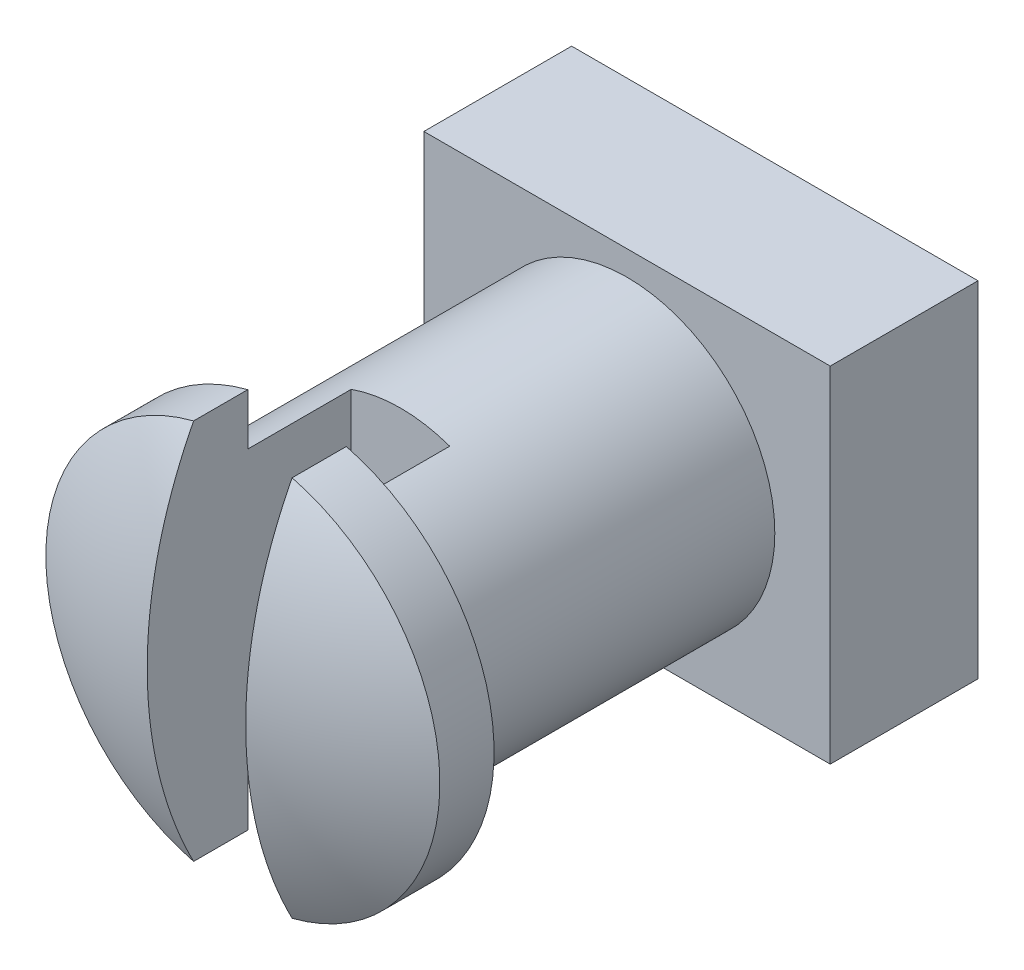
ISO-10303-21;
HEADER;
FILE_DESCRIPTION(('STEP AP214'),'2;1');
FILE_NAME('part.step','',(''),(''),'','','');
FILE_SCHEMA(('AUTOMOTIVE_DESIGN { 1 0 10303 214 1 1 1 1 }'));
ENDSEC;
DATA;
#1=APPLICATION_CONTEXT('core data for automotive mechanical design processes');
#2=APPLICATION_PROTOCOL_DEFINITION('international standard','automotive_design',2000,#1);
#3=PRODUCT_CONTEXT('',#1,'mechanical');
#4=PRODUCT('Part','Part','',(#3));
#5=PRODUCT_RELATED_PRODUCT_CATEGORY('part','',(#4));
#6=PRODUCT_DEFINITION_FORMATION('','',#4);
#7=PRODUCT_DEFINITION_CONTEXT('part definition',#1,'design');
#8=PRODUCT_DEFINITION('design','',#6,#7);
#9=PRODUCT_DEFINITION_SHAPE('','',#8);
#10=(LENGTH_UNIT() NAMED_UNIT(*) SI_UNIT(.MILLI.,.METRE.));
#11=(NAMED_UNIT(*) PLANE_ANGLE_UNIT() SI_UNIT($,.RADIAN.));
#12=(NAMED_UNIT(*) SI_UNIT($,.STERADIAN.) SOLID_ANGLE_UNIT());
#13=UNCERTAINTY_MEASURE_WITH_UNIT(LENGTH_MEASURE(1.E-05),#10,'distance_accuracy_value','');
#14=(GEOMETRIC_REPRESENTATION_CONTEXT(3) GLOBAL_UNCERTAINTY_ASSIGNED_CONTEXT((#13)) GLOBAL_UNIT_ASSIGNED_CONTEXT((#10,
#11,#12)) REPRESENTATION_CONTEXT('',''));
#15=CARTESIAN_POINT('',(0.,0.,0.));
#16=DIRECTION('',(0.,0.,1.));
#17=DIRECTION('',(1.,0.,0.));
#18=AXIS2_PLACEMENT_3D('',#15,#16,#17);
#19=CARTESIAN_POINT('',(0.,0.,12.319));
#20=DIRECTION('',(0.,0.,1.));
#21=DIRECTION('',(1.,0.,0.));
#22=AXIS2_PLACEMENT_3D('',#19,#20,#21);
#23=CYLINDRICAL_SURFACE('',#22,5.08);
#24=DIRECTION('',(0.,0.,1.));
#25=VECTOR('',#24,1.);
#26=CARTESIAN_POINT('',(1.27,4.91868884968342,12.319));
#27=LINE('',#26,#25);
#28=CARTESIAN_POINT('',(1.27,4.91868884968342,13.716));
#29=VERTEX_POINT('',#28);
#30=CARTESIAN_POINT('',(1.27,4.91868884968342,12.319));
#31=VERTEX_POINT('',#30);
#32=EDGE_CURVE('E165',#29,#31,#27,.F.);
#33=ORIENTED_EDGE('',*,*,#32,.F.);
#34=CARTESIAN_POINT('',(0.,0.,13.716));
#35=DIRECTION('',(0.,0.,1.));
#36=DIRECTION('',(1.,0.,0.));
#37=AXIS2_PLACEMENT_3D('',#34,#35,#36);
#38=CIRCLE('',#37,5.08);
#39=CARTESIAN_POINT('',(1.27,-4.91868884968342,13.716));
#40=VERTEX_POINT('',#39);
#41=EDGE_CURVE('E143',#40,#29,#38,.T.);
#42=ORIENTED_EDGE('',*,*,#41,.F.);
#43=DIRECTION('',(0.,0.,1.));
#44=VECTOR('',#43,1.);
#45=CARTESIAN_POINT('',(1.27,-4.91868884968342,12.319));
#46=LINE('',#45,#44);
#47=CARTESIAN_POINT('',(1.27,-4.91868884968342,12.319));
#48=VERTEX_POINT('',#47);
#49=EDGE_CURVE('E167',#48,#40,#46,.T.);
#50=ORIENTED_EDGE('',*,*,#49,.F.);
#51=CARTESIAN_POINT('',(0.,0.,12.319));
#52=DIRECTION('',(0.,0.,1.));
#53=DIRECTION('',(1.,0.,0.));
#54=AXIS2_PLACEMENT_3D('',#51,#52,#53);
#55=CIRCLE('',#54,5.08);
#56=EDGE_CURVE('E154',#48,#31,#55,.T.);
#57=ORIENTED_EDGE('',*,*,#56,.T.);
#58=EDGE_LOOP('',(#33,#42,#50,#57));
#59=FACE_BOUND('',#58,.T.);
#60=ADVANCED_FACE('F49',(#59),#23,.T.);
#61=CARTESIAN_POINT('',(0.,0.,12.319));
#62=DIRECTION('',(0.,0.,1.));
#63=DIRECTION('',(1.,0.,0.));
#64=AXIS2_PLACEMENT_3D('',#61,#62,#63);
#65=PLANE('',#64);
#66=ORIENTED_EDGE('',*,*,#56,.F.);
#67=DIRECTION('',(0.,1.,0.));
#68=VECTOR('',#67,1.);
#69=CARTESIAN_POINT('',(1.27,0.,12.319));
#70=LINE('',#69,#68);
#71=CARTESIAN_POINT('',(1.27,-3.59210244842766,12.319));
#72=VERTEX_POINT('',#71);
#73=EDGE_CURVE('E161',#48,#72,#70,.T.);
#74=ORIENTED_EDGE('',*,*,#73,.T.);
#75=CARTESIAN_POINT('',(0.,0.,12.319));
#76=DIRECTION('',(0.,0.,1.));
#77=DIRECTION('',(1.,0.,0.));
#78=AXIS2_PLACEMENT_3D('',#75,#76,#77);
#79=CIRCLE('',#78,3.81);
#80=CARTESIAN_POINT('',(1.27,3.59210244842766,12.319));
#81=VERTEX_POINT('',#80);
#82=EDGE_CURVE('E147',#72,#81,#79,.T.);
#83=ORIENTED_EDGE('',*,*,#82,.T.);
#84=EDGE_CURVE('E162',#81,#31,#70,.T.);
#85=ORIENTED_EDGE('',*,*,#84,.T.);
#86=EDGE_LOOP('',(#66,#74,#83,#85));
#87=FACE_BOUND('',#86,.T.);
#88=ADVANCED_FACE('F194',(#87),#65,.F.);
#89=CARTESIAN_POINT('',(0.,0.,4.19099999999999));
#90=DIRECTION('',(0.,0.,1.));
#91=DIRECTION('',(1.,0.,0.));
#92=AXIS2_PLACEMENT_3D('',#89,#90,#91);
#93=SPHERICAL_SURFACE('',#92,10.795);
#94=CARTESIAN_POINT('',(1.27,0.,4.19099999999999));
#95=DIRECTION('',(1.,0.,0.));
#96=DIRECTION('',(0.,0.,-1.));
#97=AXIS2_PLACEMENT_3D('',#94,#95,#96);
#98=CIRCLE('',#97,10.7200338152452);
#99=EDGE_CURVE('E136',#40,#29,#98,.F.);
#100=ORIENTED_EDGE('',*,*,#99,.F.);
#101=ORIENTED_EDGE('',*,*,#41,.T.);
#102=EDGE_LOOP('',(#100,#101));
#103=FACE_BOUND('',#102,.T.);
#104=ADVANCED_FACE('F186',(#103),#93,.T.);
#105=CARTESIAN_POINT('',(0.,0.,13.716));
#106=DIRECTION('',(0.,0.,-1.));
#107=DIRECTION('',(-1.,0.,0.));
#108=AXIS2_PLACEMENT_3D('',#105,#106,#107);
#109=CYLINDRICAL_SURFACE('',#108,3.81);
#110=CARTESIAN_POINT('',(0.,0.,9.65199999999999));
#111=DIRECTION('',(0.,0.,-1.));
#112=DIRECTION('',(-1.,0.,0.));
#113=AXIS2_PLACEMENT_3D('',#110,#111,#112);
#114=CIRCLE('',#113,3.81);
#115=CARTESIAN_POINT('',(-1.27,3.59210244842766,9.65199999999999));
#116=VERTEX_POINT('',#115);
#117=CARTESIAN_POINT('',(1.27,3.59210244842766,9.65199999999999));
#118=VERTEX_POINT('',#117);
#119=EDGE_CURVE('E12',#116,#118,#114,.T.);
#120=ORIENTED_EDGE('',*,*,#119,.T.);
#121=DIRECTION('',(0.,0.,-1.));
#122=VECTOR('',#121,1.);
#123=CARTESIAN_POINT('',(1.27,3.59210244842766,13.716));
#124=LINE('',#123,#122);
#125=EDGE_CURVE('E158',#118,#81,#124,.F.);
#126=ORIENTED_EDGE('',*,*,#125,.T.);
#127=ORIENTED_EDGE('',*,*,#82,.F.);
#128=DIRECTION('',(0.,0.,-1.));
#129=VECTOR('',#128,1.);
#130=CARTESIAN_POINT('',(1.27,-3.59210244842766,13.716));
#131=LINE('',#130,#129);
#132=CARTESIAN_POINT('',(1.27,-3.59210244842766,9.65199999999999));
#133=VERTEX_POINT('',#132);
#134=EDGE_CURVE('E72',#72,#133,#131,.T.);
#135=ORIENTED_EDGE('',*,*,#134,.T.);
#136=CARTESIAN_POINT('',(-1.27,-3.59210244842766,9.65199999999999));
#137=VERTEX_POINT('',#136);
#138=EDGE_CURVE('E53',#133,#137,#114,.T.);
#139=ORIENTED_EDGE('',*,*,#138,.T.);
#140=DIRECTION('',(0.,0.,-1.));
#141=VECTOR('',#140,1.);
#142=CARTESIAN_POINT('',(-1.27,-3.59210244842766,13.716));
#143=LINE('',#142,#141);
#144=CARTESIAN_POINT('',(-1.27,-3.59210244842766,12.319));
#145=VERTEX_POINT('',#144);
#146=EDGE_CURVE('E114',#137,#145,#143,.F.);
#147=ORIENTED_EDGE('',*,*,#146,.T.);
#148=CARTESIAN_POINT('',(-1.27,3.59210244842766,12.319));
#149=VERTEX_POINT('',#148);
#150=EDGE_CURVE('E140',#149,#145,#79,.T.);
#151=ORIENTED_EDGE('',*,*,#150,.F.);
#152=DIRECTION('',(0.,0.,-1.));
#153=VECTOR('',#152,1.);
#154=CARTESIAN_POINT('',(-1.27,3.59210244842766,13.716));
#155=LINE('',#154,#153);
#156=EDGE_CURVE('E125',#149,#116,#155,.T.);
#157=ORIENTED_EDGE('',*,*,#156,.T.);
#158=EDGE_LOOP('',(#120,#126,#127,#135,#139,#147,#151,#157));
#159=FACE_BOUND('',#158,.T.);
#160=CARTESIAN_POINT('',(0.,0.,3.81));
#161=DIRECTION('',(0.,0.,1.));
#162=DIRECTION('',(1.,0.,0.));
#163=AXIS2_PLACEMENT_3D('',#160,#161,#162);
#164=CIRCLE('',#163,3.81);
#165=CARTESIAN_POINT('',(3.81,0.,3.81));
#166=VERTEX_POINT('',#165);
#167=EDGE_CURVE('E150',#166,#166,#164,.T.);
#168=ORIENTED_EDGE('',*,*,#167,.T.);
#169=EDGE_LOOP('',(#168));
#170=FACE_BOUND('',#169,.T.);
#171=ADVANCED_FACE('F133',(#159,#170),#109,.T.);
#172=CARTESIAN_POINT('',(0.,0.,3.81));
#173=DIRECTION('',(0.,0.,1.));
#174=DIRECTION('',(1.,0.,0.));
#175=AXIS2_PLACEMENT_3D('',#172,#173,#174);
#176=PLANE('',#175);
#177=ORIENTED_EDGE('',*,*,#167,.F.);
#178=EDGE_LOOP('',(#177));
#179=FACE_BOUND('',#178,.T.);
#180=ADVANCED_FACE('F206',(#179),#176,.F.);
#181=DIRECTION('',(0.,0.,1.));
#182=VECTOR('',#181,1.);
#183=CARTESIAN_POINT('',(-1.27,-4.91868884968342,12.319));
#184=LINE('',#183,#182);
#185=CARTESIAN_POINT('',(-1.27,-4.91868884968342,13.716));
#186=VERTEX_POINT('',#185);
#187=CARTESIAN_POINT('',(-1.27,-4.91868884968342,12.319));
#188=VERTEX_POINT('',#187);
#189=EDGE_CURVE('E171',#186,#188,#184,.F.);
#190=ORIENTED_EDGE('',*,*,#189,.F.);
#191=CARTESIAN_POINT('',(-1.27,4.91868884968342,13.716));
#192=VERTEX_POINT('',#191);
#193=EDGE_CURVE('E146',#192,#186,#38,.T.);
#194=ORIENTED_EDGE('',*,*,#193,.F.);
#195=DIRECTION('',(0.,0.,1.));
#196=VECTOR('',#195,1.);
#197=CARTESIAN_POINT('',(-1.27,4.91868884968342,12.319));
#198=LINE('',#197,#196);
#199=CARTESIAN_POINT('',(-1.27,4.91868884968342,12.319));
#200=VERTEX_POINT('',#199);
#201=EDGE_CURVE('E64',#200,#192,#198,.T.);
#202=ORIENTED_EDGE('',*,*,#201,.F.);
#203=EDGE_CURVE('E153',#200,#188,#55,.T.);
#204=ORIENTED_EDGE('',*,*,#203,.T.);
#205=EDGE_LOOP('',(#190,#194,#202,#204));
#206=FACE_BOUND('',#205,.T.);
#207=ADVANCED_FACE('F181',(#206),#23,.T.);
#208=ORIENTED_EDGE('',*,*,#203,.F.);
#209=DIRECTION('',(0.,-1.,0.));
#210=VECTOR('',#209,1.);
#211=CARTESIAN_POINT('',(-1.27,0.,12.319));
#212=LINE('',#211,#210);
#213=EDGE_CURVE('E126',#200,#149,#212,.T.);
#214=ORIENTED_EDGE('',*,*,#213,.T.);
#215=ORIENTED_EDGE('',*,*,#150,.T.);
#216=EDGE_CURVE('E120',#145,#188,#212,.T.);
#217=ORIENTED_EDGE('',*,*,#216,.T.);
#218=EDGE_LOOP('',(#208,#214,#215,#217));
#219=FACE_BOUND('',#218,.T.);
#220=ADVANCED_FACE('F177',(#219),#65,.F.);
#221=CARTESIAN_POINT('',(-1.27,0.,4.19099999999999));
#222=DIRECTION('',(-1.,0.,0.));
#223=DIRECTION('',(0.,0.,1.));
#224=AXIS2_PLACEMENT_3D('',#221,#222,#223);
#225=CIRCLE('',#224,10.7200338152452);
#226=EDGE_CURVE('E137',#192,#186,#225,.F.);
#227=ORIENTED_EDGE('',*,*,#226,.F.);
#228=ORIENTED_EDGE('',*,*,#193,.T.);
#229=EDGE_LOOP('',(#227,#228));
#230=FACE_BOUND('',#229,.T.);
#231=ADVANCED_FACE('F51',(#230),#93,.T.);
#232=CARTESIAN_POINT('',(-1.27,-5.08,9.65199999999999));
#233=DIRECTION('',(0.,0.,-1.));
#234=DIRECTION('',(-1.,0.,0.));
#235=AXIS2_PLACEMENT_3D('',#232,#233,#234);
#236=PLANE('',#235);
#237=DIRECTION('',(0.,1.,0.));
#238=VECTOR('',#237,1.);
#239=CARTESIAN_POINT('',(-1.27,-5.08,9.65199999999999));
#240=LINE('',#239,#238);
#241=EDGE_CURVE('E117',#137,#116,#240,.T.);
#242=ORIENTED_EDGE('',*,*,#241,.F.);
#243=ORIENTED_EDGE('',*,*,#138,.F.);
#244=DIRECTION('',(0.,1.,0.));
#245=VECTOR('',#244,1.);
#246=CARTESIAN_POINT('',(1.27,-5.08,9.65199999999999));
#247=LINE('',#246,#245);
#248=EDGE_CURVE('E131',#133,#118,#247,.T.);
#249=ORIENTED_EDGE('',*,*,#248,.T.);
#250=ORIENTED_EDGE('',*,*,#119,.F.);
#251=EDGE_LOOP('',(#242,#243,#249,#250));
#252=FACE_BOUND('',#251,.T.);
#253=ADVANCED_FACE('F129',(#252),#236,.F.);
#254=CARTESIAN_POINT('',(1.27,-5.08,9.65199999999999));
#255=DIRECTION('',(1.,0.,0.));
#256=DIRECTION('',(0.,0.,-1.));
#257=AXIS2_PLACEMENT_3D('',#254,#255,#256);
#258=PLANE('',#257);
#259=ORIENTED_EDGE('',*,*,#73,.F.);
#260=ORIENTED_EDGE('',*,*,#49,.T.);
#261=ORIENTED_EDGE('',*,*,#99,.T.);
#262=ORIENTED_EDGE('',*,*,#32,.T.);
#263=ORIENTED_EDGE('',*,*,#84,.F.);
#264=ORIENTED_EDGE('',*,*,#125,.F.);
#265=ORIENTED_EDGE('',*,*,#248,.F.);
#266=ORIENTED_EDGE('',*,*,#134,.F.);
#267=EDGE_LOOP('',(#259,#260,#261,#262,#263,#264,#265,#266));
#268=FACE_BOUND('',#267,.T.);
#269=ADVANCED_FACE('F191',(#268),#258,.F.);
#270=CARTESIAN_POINT('',(-1.27,-5.08,9.65199999999999));
#271=DIRECTION('',(-1.,0.,0.));
#272=DIRECTION('',(0.,0.,1.));
#273=AXIS2_PLACEMENT_3D('',#270,#271,#272);
#274=PLANE('',#273);
#275=ORIENTED_EDGE('',*,*,#213,.F.);
#276=ORIENTED_EDGE('',*,*,#201,.T.);
#277=ORIENTED_EDGE('',*,*,#226,.T.);
#278=ORIENTED_EDGE('',*,*,#189,.T.);
#279=ORIENTED_EDGE('',*,*,#216,.F.);
#280=ORIENTED_EDGE('',*,*,#146,.F.);
#281=ORIENTED_EDGE('',*,*,#241,.T.);
#282=ORIENTED_EDGE('',*,*,#156,.F.);
#283=EDGE_LOOP('',(#275,#276,#277,#278,#279,#280,#281,#282));
#284=FACE_BOUND('',#283,.T.);
#285=ADVANCED_FACE('F116',(#284),#274,.F.);
#286=CLOSED_SHELL('',(#60,#88,#104,#171,#180,#207,#220,#231,#253,#269,#285));
#287=MANIFOLD_SOLID_BREP('B2',#286);
#288=CARTESIAN_POINT('',(5.23875,4.445,3.81));
#289=DIRECTION('',(-1.,0.,0.));
#290=DIRECTION('',(0.,-1.,0.));
#291=AXIS2_PLACEMENT_3D('',#288,#289,#290);
#292=PLANE('',#291);
#293=DIRECTION('',(0.,1.,0.));
#294=VECTOR('',#293,1.);
#295=CARTESIAN_POINT('',(5.23875,4.445,0.));
#296=LINE('',#295,#294);
#297=CARTESIAN_POINT('',(5.23875,-4.445,0.));
#298=VERTEX_POINT('',#297);
#299=CARTESIAN_POINT('',(5.23875,4.445,0.));
#300=VERTEX_POINT('',#299);
#301=EDGE_CURVE('E351',#298,#300,#296,.T.);
#302=ORIENTED_EDGE('',*,*,#301,.T.);
#303=DIRECTION('',(0.,0.,-1.));
#304=VECTOR('',#303,1.);
#305=CARTESIAN_POINT('',(5.23875,4.445,3.81));
#306=LINE('',#305,#304);
#307=CARTESIAN_POINT('',(5.23875,4.445,3.81));
#308=VERTEX_POINT('',#307);
#309=EDGE_CURVE('E47',#308,#300,#306,.T.);
#310=ORIENTED_EDGE('',*,*,#309,.F.);
#311=DIRECTION('',(0.,1.,0.));
#312=VECTOR('',#311,1.);
#313=CARTESIAN_POINT('',(5.23875,4.445,3.81));
#314=LINE('',#313,#312);
#315=CARTESIAN_POINT('',(5.23875,-4.445,3.81));
#316=VERTEX_POINT('',#315);
#317=EDGE_CURVE('E339',#316,#308,#314,.T.);
#318=ORIENTED_EDGE('',*,*,#317,.F.);
#319=DIRECTION('',(0.,0.,-1.));
#320=VECTOR('',#319,1.);
#321=CARTESIAN_POINT('',(5.23875,-4.445,3.81));
#322=LINE('',#321,#320);
#323=EDGE_CURVE('E347',#316,#298,#322,.T.);
#324=ORIENTED_EDGE('',*,*,#323,.T.);
#325=EDGE_LOOP('',(#302,#310,#318,#324));
#326=FACE_BOUND('',#325,.T.);
#327=ADVANCED_FACE('F288',(#326),#292,.F.);
#328=CARTESIAN_POINT('',(-5.23875,4.445,3.81));
#329=DIRECTION('',(0.,-1.,0.));
#330=DIRECTION('',(0.,0.,-1.));
#331=AXIS2_PLACEMENT_3D('',#328,#329,#330);
#332=PLANE('',#331);
#333=DIRECTION('',(-1.,0.,0.));
#334=VECTOR('',#333,1.);
#335=CARTESIAN_POINT('',(-5.23875,4.445,0.));
#336=LINE('',#335,#334);
#337=CARTESIAN_POINT('',(-5.23875,4.445,0.));
#338=VERTEX_POINT('',#337);
#339=EDGE_CURVE('E343',#300,#338,#336,.T.);
#340=ORIENTED_EDGE('',*,*,#339,.T.);
#341=DIRECTION('',(0.,0.,-1.));
#342=VECTOR('',#341,1.);
#343=CARTESIAN_POINT('',(-5.23875,4.445,3.81));
#344=LINE('',#343,#342);
#345=CARTESIAN_POINT('',(-5.23875,4.445,3.81));
#346=VERTEX_POINT('',#345);
#347=EDGE_CURVE('E296',#346,#338,#344,.T.);
#348=ORIENTED_EDGE('',*,*,#347,.F.);
#349=DIRECTION('',(-1.,0.,0.));
#350=VECTOR('',#349,1.);
#351=CARTESIAN_POINT('',(-5.23875,4.445,3.81));
#352=LINE('',#351,#350);
#353=EDGE_CURVE('E334',#308,#346,#352,.T.);
#354=ORIENTED_EDGE('',*,*,#353,.F.);
#355=ORIENTED_EDGE('',*,*,#309,.T.);
#356=EDGE_LOOP('',(#340,#348,#354,#355));
#357=FACE_BOUND('',#356,.T.);
#358=ADVANCED_FACE('F342',(#357),#332,.F.);
#359=CARTESIAN_POINT('',(-5.23875,4.445,3.81));
#360=DIRECTION('',(1.,0.,0.));
#361=DIRECTION('',(0.,1.,0.));
#362=AXIS2_PLACEMENT_3D('',#359,#360,#361);
#363=PLANE('',#362);
#364=DIRECTION('',(0.,-1.,0.));
#365=VECTOR('',#364,1.);
#366=CARTESIAN_POINT('',(-5.23875,4.445,0.));
#367=LINE('',#366,#365);
#368=CARTESIAN_POINT('',(-5.23875,-4.445,0.));
#369=VERTEX_POINT('',#368);
#370=EDGE_CURVE('E321',#338,#369,#367,.T.);
#371=ORIENTED_EDGE('',*,*,#370,.T.);
#372=DIRECTION('',(0.,0.,-1.));
#373=VECTOR('',#372,1.);
#374=CARTESIAN_POINT('',(-5.23875,-4.445,3.81));
#375=LINE('',#374,#373);
#376=CARTESIAN_POINT('',(-5.23875,-4.445,3.81));
#377=VERTEX_POINT('',#376);
#378=EDGE_CURVE('E344',#377,#369,#375,.T.);
#379=ORIENTED_EDGE('',*,*,#378,.F.);
#380=DIRECTION('',(0.,-1.,0.));
#381=VECTOR('',#380,1.);
#382=CARTESIAN_POINT('',(-5.23875,4.445,3.81));
#383=LINE('',#382,#381);
#384=EDGE_CURVE('E337',#346,#377,#383,.T.);
#385=ORIENTED_EDGE('',*,*,#384,.F.);
#386=ORIENTED_EDGE('',*,*,#347,.T.);
#387=EDGE_LOOP('',(#371,#379,#385,#386));
#388=FACE_BOUND('',#387,.T.);
#389=ADVANCED_FACE('F345',(#388),#363,.F.);
#390=CARTESIAN_POINT('',(-5.23875,-4.445,3.81));
#391=DIRECTION('',(0.,1.,0.));
#392=DIRECTION('',(0.,0.,1.));
#393=AXIS2_PLACEMENT_3D('',#390,#391,#392);
#394=PLANE('',#393);
#395=DIRECTION('',(1.,0.,0.));
#396=VECTOR('',#395,1.);
#397=CARTESIAN_POINT('',(-5.23875,-4.445,0.));
#398=LINE('',#397,#396);
#399=EDGE_CURVE('E327',#369,#298,#398,.T.);
#400=ORIENTED_EDGE('',*,*,#399,.T.);
#401=ORIENTED_EDGE('',*,*,#323,.F.);
#402=DIRECTION('',(1.,0.,0.));
#403=VECTOR('',#402,1.);
#404=CARTESIAN_POINT('',(-5.23875,-4.445,3.81));
#405=LINE('',#404,#403);
#406=EDGE_CURVE('E304',#377,#316,#405,.T.);
#407=ORIENTED_EDGE('',*,*,#406,.F.);
#408=ORIENTED_EDGE('',*,*,#378,.T.);
#409=EDGE_LOOP('',(#400,#401,#407,#408));
#410=FACE_BOUND('',#409,.T.);
#411=ADVANCED_FACE('F358',(#410),#394,.F.);
#412=CARTESIAN_POINT('',(0.,0.,3.81));
#413=DIRECTION('',(0.,0.,1.));
#414=DIRECTION('',(1.,0.,0.));
#415=AXIS2_PLACEMENT_3D('',#412,#413,#414);
#416=PLANE('',#415);
#417=ORIENTED_EDGE('',*,*,#317,.T.);
#418=ORIENTED_EDGE('',*,*,#353,.T.);
#419=ORIENTED_EDGE('',*,*,#384,.T.);
#420=ORIENTED_EDGE('',*,*,#406,.T.);
#421=EDGE_LOOP('',(#417,#418,#419,#420));
#422=FACE_BOUND('',#421,.T.);
#423=ADVANCED_FACE('F335',(#422),#416,.T.);
#424=CARTESIAN_POINT('',(0.,0.,0.));
#425=DIRECTION('',(0.,0.,1.));
#426=DIRECTION('',(1.,0.,0.));
#427=AXIS2_PLACEMENT_3D('',#424,#425,#426);
#428=PLANE('',#427);
#429=ORIENTED_EDGE('',*,*,#301,.F.);
#430=ORIENTED_EDGE('',*,*,#399,.F.);
#431=ORIENTED_EDGE('',*,*,#370,.F.);
#432=ORIENTED_EDGE('',*,*,#339,.F.);
#433=EDGE_LOOP('',(#429,#430,#431,#432));
#434=FACE_BOUND('',#433,.T.);
#435=ADVANCED_FACE('F361',(#434),#428,.F.);
#436=CLOSED_SHELL('',(#327,#358,#389,#411,#423,#435));
#437=MANIFOLD_SOLID_BREP('B6',#436);
#438=ADVANCED_BREP_SHAPE_REPRESENTATION('',(#18,#287,#437),#14);
#439=SHAPE_DEFINITION_REPRESENTATION(#9,#438);
ENDSEC;
END-ISO-10303-21;
